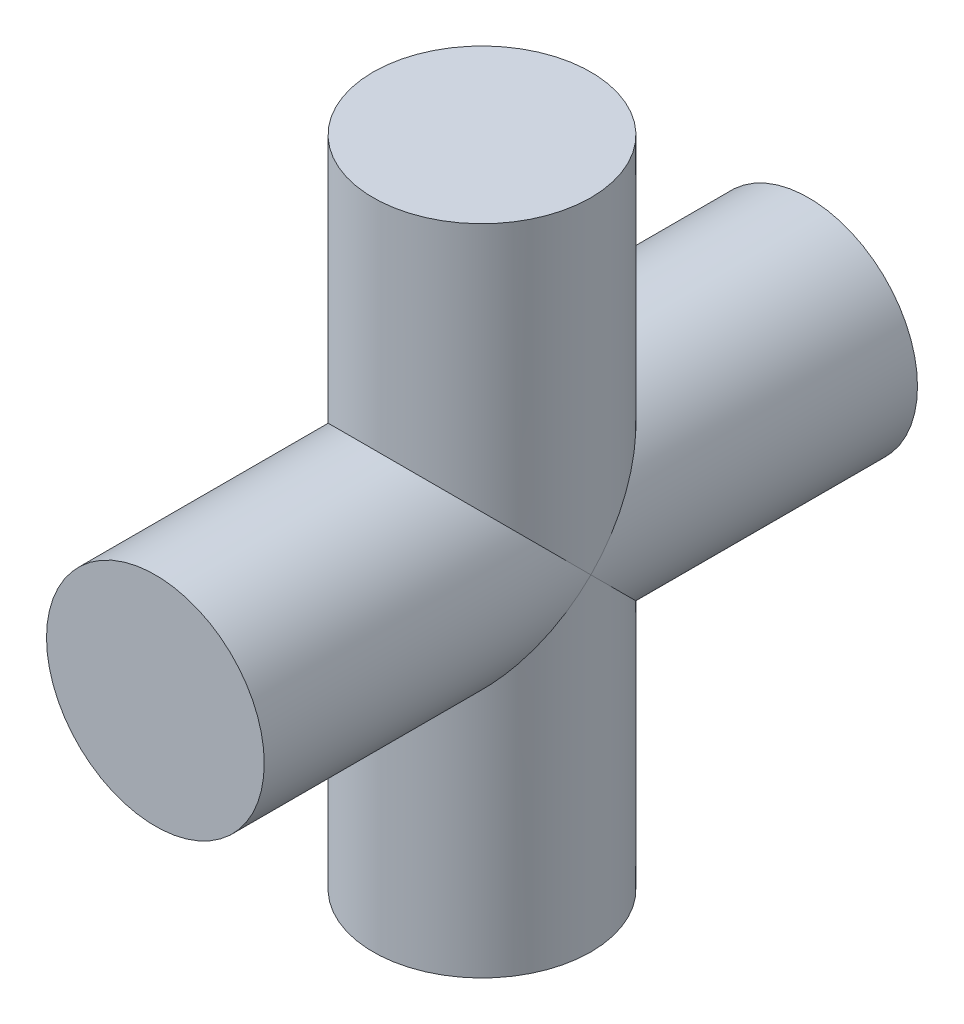
ISO-10303-21;
HEADER;
FILE_DESCRIPTION(('STEP AP214'),'2;1');
FILE_NAME('part.step','',(''),(''),'','','');
FILE_SCHEMA(('AUTOMOTIVE_DESIGN { 1 0 10303 214 1 1 1 1 }'));
ENDSEC;
DATA;
#1=APPLICATION_CONTEXT('core data for automotive mechanical design processes');
#2=APPLICATION_PROTOCOL_DEFINITION('international standard','automotive_design',2000,#1);
#3=PRODUCT_CONTEXT('',#1,'mechanical');
#4=PRODUCT('Part','Part','',(#3));
#5=PRODUCT_RELATED_PRODUCT_CATEGORY('part','',(#4));
#6=PRODUCT_DEFINITION_FORMATION('','',#4);
#7=PRODUCT_DEFINITION_CONTEXT('part definition',#1,'design');
#8=PRODUCT_DEFINITION('design','',#6,#7);
#9=PRODUCT_DEFINITION_SHAPE('','',#8);
#10=(LENGTH_UNIT() NAMED_UNIT(*) SI_UNIT(.MILLI.,.METRE.));
#11=(NAMED_UNIT(*) PLANE_ANGLE_UNIT() SI_UNIT($,.RADIAN.));
#12=(NAMED_UNIT(*) SI_UNIT($,.STERADIAN.) SOLID_ANGLE_UNIT());
#13=UNCERTAINTY_MEASURE_WITH_UNIT(LENGTH_MEASURE(1.E-05),#10,'distance_accuracy_value','');
#14=(GEOMETRIC_REPRESENTATION_CONTEXT(3) GLOBAL_UNCERTAINTY_ASSIGNED_CONTEXT((#13)) GLOBAL_UNIT_ASSIGNED_CONTEXT((#10,
#11,#12)) REPRESENTATION_CONTEXT('',''));
#15=CARTESIAN_POINT('',(0.,0.,0.));
#16=DIRECTION('',(0.,0.,1.));
#17=DIRECTION('',(1.,0.,0.));
#18=AXIS2_PLACEMENT_3D('',#15,#16,#17);
#19=CARTESIAN_POINT('',(0.,-33.,0.));
#20=DIRECTION('',(0.,-1.,0.));
#21=DIRECTION('',(1.,0.,0.));
#22=AXIS2_PLACEMENT_3D('',#19,#20,#21);
#23=PLANE('',#22);
#24=CARTESIAN_POINT('',(0.,-33.,0.));
#25=DIRECTION('',(0.,1.,0.));
#26=DIRECTION('',(-1.,0.,0.));
#27=AXIS2_PLACEMENT_3D('',#24,#25,#26);
#28=CIRCLE('',#27,11.);
#29=CARTESIAN_POINT('',(-11.,-33.,0.));
#30=VERTEX_POINT('',#29);
#31=EDGE_CURVE('E60',#30,#30,#28,.T.);
#32=ORIENTED_EDGE('',*,*,#31,.F.);
#33=EDGE_LOOP('',(#32));
#34=FACE_BOUND('',#33,.T.);
#35=ADVANCED_FACE('F33',(#34),#23,.T.);
#36=CARTESIAN_POINT('',(0.,33.,0.));
#37=DIRECTION('',(0.,1.,0.));
#38=DIRECTION('',(-1.,0.,0.));
#39=AXIS2_PLACEMENT_3D('',#36,#37,#38);
#40=CYLINDRICAL_SURFACE('',#39,11.);
#41=CARTESIAN_POINT('',(0.,0.,0.));
#42=DIRECTION('',(0.,0.707106781186547,-0.707106781186547));
#43=DIRECTION('',(0.,0.707106781186547,0.707106781186547));
#44=AXIS2_PLACEMENT_3D('',#41,#42,#43);
#45=ELLIPSE('',#44,15.556349186104,11.);
#46=CARTESIAN_POINT('',(11.,0.,0.));
#47=VERTEX_POINT('',#46);
#48=CARTESIAN_POINT('',(-11.,0.,0.));
#49=VERTEX_POINT('',#48);
#50=EDGE_CURVE('E40',#47,#49,#45,.T.);
#51=ORIENTED_EDGE('',*,*,#50,.F.);
#52=CARTESIAN_POINT('',(0.,0.,0.));
#53=DIRECTION('',(0.,0.707106781186547,0.707106781186547));
#54=DIRECTION('',(0.,0.707106781186547,-0.707106781186547));
#55=AXIS2_PLACEMENT_3D('',#52,#53,#54);
#56=ELLIPSE('',#55,15.556349186104,11.);
#57=EDGE_CURVE('E52',#49,#47,#56,.T.);
#58=ORIENTED_EDGE('',*,*,#57,.F.);
#59=EDGE_LOOP('',(#51,#58));
#60=FACE_BOUND('',#59,.T.);
#61=ORIENTED_EDGE('',*,*,#31,.T.);
#62=EDGE_LOOP('',(#61));
#63=FACE_BOUND('',#62,.T.);
#64=ADVANCED_FACE('F53',(#60,#63),#40,.T.);
#65=CARTESIAN_POINT('',(-11.,0.,-33.));
#66=DIRECTION('',(0.,0.,-1.));
#67=DIRECTION('',(-1.,0.,0.));
#68=AXIS2_PLACEMENT_3D('',#65,#66,#67);
#69=PLANE('',#68);
#70=CARTESIAN_POINT('',(0.,0.,-33.));
#71=DIRECTION('',(0.,0.,-1.));
#72=DIRECTION('',(-1.,0.,0.));
#73=AXIS2_PLACEMENT_3D('',#70,#71,#72);
#74=CIRCLE('',#73,11.);
#75=CARTESIAN_POINT('',(-11.,0.,-33.));
#76=VERTEX_POINT('',#75);
#77=EDGE_CURVE('E73',#76,#76,#74,.T.);
#78=ORIENTED_EDGE('',*,*,#77,.T.);
#79=EDGE_LOOP('',(#78));
#80=FACE_BOUND('',#79,.T.);
#81=ADVANCED_FACE('F87',(#80),#69,.T.);
#82=CARTESIAN_POINT('',(0.,0.,-33.));
#83=DIRECTION('',(0.,0.,-1.));
#84=DIRECTION('',(-1.,0.,0.));
#85=AXIS2_PLACEMENT_3D('',#82,#83,#84);
#86=CYLINDRICAL_SURFACE('',#85,11.);
#87=ORIENTED_EDGE('',*,*,#77,.F.);
#88=EDGE_LOOP('',(#87));
#89=FACE_BOUND('',#88,.T.);
#90=CARTESIAN_POINT('',(0.,0.,0.));
#91=DIRECTION('',(0.,0.707106781186547,0.707106781186547));
#92=DIRECTION('',(0.,0.707106781186547,-0.707106781186547));
#93=AXIS2_PLACEMENT_3D('',#90,#91,#92);
#94=ELLIPSE('',#93,15.556349186104,11.);
#95=EDGE_CURVE('E46',#49,#47,#94,.F.);
#96=ORIENTED_EDGE('',*,*,#95,.T.);
#97=ORIENTED_EDGE('',*,*,#50,.T.);
#98=EDGE_LOOP('',(#96,#97));
#99=FACE_BOUND('',#98,.T.);
#100=ADVANCED_FACE('F62',(#89,#99),#86,.T.);
#101=CARTESIAN_POINT('',(0.,33.,0.));
#102=DIRECTION('',(0.,1.,0.));
#103=DIRECTION('',(-1.,0.,0.));
#104=AXIS2_PLACEMENT_3D('',#101,#102,#103);
#105=PLANE('',#104);
#106=CARTESIAN_POINT('',(0.,33.,0.));
#107=DIRECTION('',(0.,1.,0.));
#108=DIRECTION('',(-1.,0.,0.));
#109=AXIS2_PLACEMENT_3D('',#106,#107,#108);
#110=CIRCLE('',#109,11.);
#111=CARTESIAN_POINT('',(-11.,33.,0.));
#112=VERTEX_POINT('',#111);
#113=EDGE_CURVE('E72',#112,#112,#110,.T.);
#114=ORIENTED_EDGE('',*,*,#113,.T.);
#115=EDGE_LOOP('',(#114));
#116=FACE_BOUND('',#115,.T.);
#117=ADVANCED_FACE('F95',(#116),#105,.T.);
#118=CARTESIAN_POINT('',(0.,0.,0.));
#119=DIRECTION('',(0.,0.707106781186547,-0.707106781186547));
#120=DIRECTION('',(0.,0.707106781186547,0.707106781186547));
#121=AXIS2_PLACEMENT_3D('',#118,#119,#120);
#122=ELLIPSE('',#121,15.556349186104,11.);
#123=EDGE_CURVE('E11',#47,#49,#122,.F.);
#124=ORIENTED_EDGE('',*,*,#123,.F.);
#125=ORIENTED_EDGE('',*,*,#95,.F.);
#126=EDGE_LOOP('',(#124,#125));
#127=FACE_BOUND('',#126,.T.);
#128=ORIENTED_EDGE('',*,*,#113,.F.);
#129=EDGE_LOOP('',(#128));
#130=FACE_BOUND('',#129,.T.);
#131=ADVANCED_FACE('F58',(#127,#130),#40,.T.);
#132=ORIENTED_EDGE('',*,*,#57,.T.);
#133=ORIENTED_EDGE('',*,*,#123,.T.);
#134=EDGE_LOOP('',(#132,#133));
#135=FACE_BOUND('',#134,.T.);
#136=CARTESIAN_POINT('',(0.,0.,33.));
#137=DIRECTION('',(0.,0.,-1.));
#138=DIRECTION('',(-1.,0.,0.));
#139=AXIS2_PLACEMENT_3D('',#136,#137,#138);
#140=CIRCLE('',#139,11.);
#141=CARTESIAN_POINT('',(-11.,0.,33.));
#142=VERTEX_POINT('',#141);
#143=EDGE_CURVE('E70',#142,#142,#140,.T.);
#144=ORIENTED_EDGE('',*,*,#143,.T.);
#145=EDGE_LOOP('',(#144));
#146=FACE_BOUND('',#145,.T.);
#147=ADVANCED_FACE('F63',(#135,#146),#86,.T.);
#148=CARTESIAN_POINT('',(-11.,0.,33.));
#149=DIRECTION('',(0.,0.,1.));
#150=DIRECTION('',(1.,0.,0.));
#151=AXIS2_PLACEMENT_3D('',#148,#149,#150);
#152=PLANE('',#151);
#153=ORIENTED_EDGE('',*,*,#143,.F.);
#154=EDGE_LOOP('',(#153));
#155=FACE_BOUND('',#154,.T.);
#156=ADVANCED_FACE('F66',(#155),#152,.T.);
#157=CLOSED_SHELL('',(#35,#64,#81,#100,#117,#131,#147,#156));
#158=MANIFOLD_SOLID_BREP('B2',#157);
#159=ADVANCED_BREP_SHAPE_REPRESENTATION('',(#18,#158),#14);
#160=SHAPE_DEFINITION_REPRESENTATION(#9,#159);
ENDSEC;
END-ISO-10303-21;
